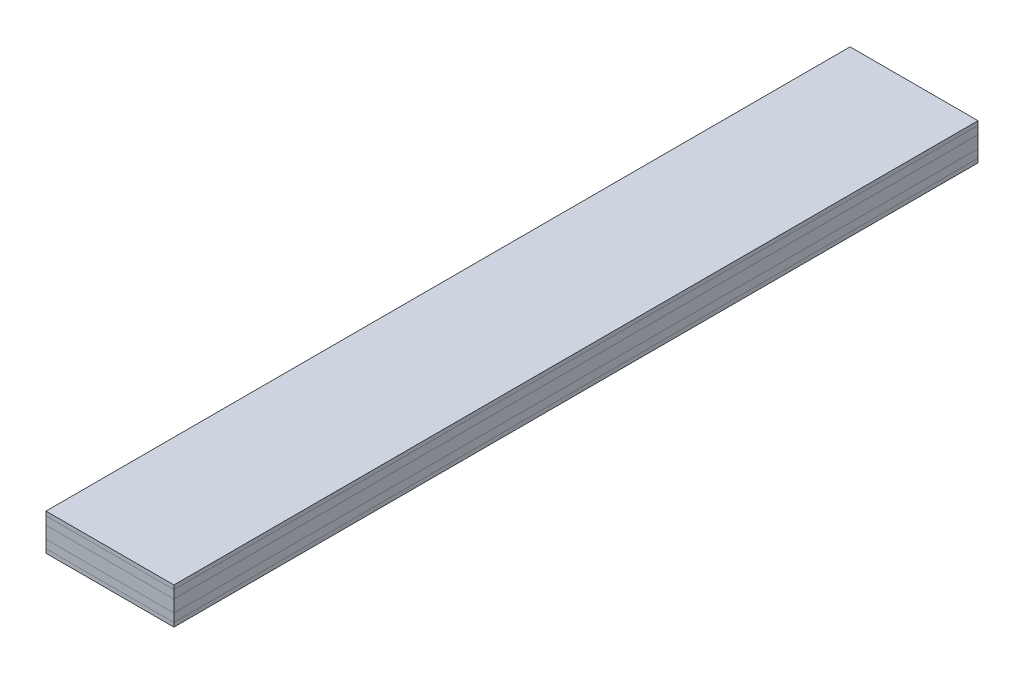
ISO-10303-21;
HEADER;
FILE_DESCRIPTION(('STEP AP214'),'2;1');
FILE_NAME('part.step','',(''),(''),'','','');
FILE_SCHEMA(('AUTOMOTIVE_DESIGN { 1 0 10303 214 1 1 1 1 }'));
ENDSEC;
DATA;
#1=APPLICATION_CONTEXT('core data for automotive mechanical design processes');
#2=APPLICATION_PROTOCOL_DEFINITION('international standard','automotive_design',2000,#1);
#3=PRODUCT_CONTEXT('',#1,'mechanical');
#4=PRODUCT('Part','Part','',(#3));
#5=PRODUCT_RELATED_PRODUCT_CATEGORY('part','',(#4));
#6=PRODUCT_DEFINITION_FORMATION('','',#4);
#7=PRODUCT_DEFINITION_CONTEXT('part definition',#1,'design');
#8=PRODUCT_DEFINITION('design','',#6,#7);
#9=PRODUCT_DEFINITION_SHAPE('','',#8);
#10=(LENGTH_UNIT() NAMED_UNIT(*) SI_UNIT(.MILLI.,.METRE.));
#11=(NAMED_UNIT(*) PLANE_ANGLE_UNIT() SI_UNIT($,.RADIAN.));
#12=(NAMED_UNIT(*) SI_UNIT($,.STERADIAN.) SOLID_ANGLE_UNIT());
#13=UNCERTAINTY_MEASURE_WITH_UNIT(LENGTH_MEASURE(1.E-05),#10,'distance_accuracy_value','');
#14=(GEOMETRIC_REPRESENTATION_CONTEXT(3) GLOBAL_UNCERTAINTY_ASSIGNED_CONTEXT((#13)) GLOBAL_UNIT_ASSIGNED_CONTEXT((#10,
#11,#12)) REPRESENTATION_CONTEXT('',''));
#15=CARTESIAN_POINT('',(0.,0.,0.));
#16=DIRECTION('',(0.,0.,1.));
#17=DIRECTION('',(1.,0.,0.));
#18=AXIS2_PLACEMENT_3D('',#15,#16,#17);
#19=CARTESIAN_POINT('',(-335.28,-2.82222222222222,-609.61));
#20=DIRECTION('',(0.,-1.,0.));
#21=DIRECTION('',(1.,0.,0.));
#22=AXIS2_PLACEMENT_3D('',#19,#20,#21);
#23=PLANE('',#22);
#24=DIRECTION('',(0.,0.,1.));
#25=VECTOR('',#24,1.);
#26=CARTESIAN_POINT('',(215.9,-2.82222222222212,-609.61));
#27=LINE('',#26,#25);
#28=CARTESIAN_POINT('',(215.9,-2.82222222222212,50.8000000000001));
#29=VERTEX_POINT('',#28);
#30=CARTESIAN_POINT('',(215.9,-2.82222222222212,609.6));
#31=VERTEX_POINT('',#30);
#32=EDGE_CURVE('E62',#29,#31,#27,.T.);
#33=ORIENTED_EDGE('',*,*,#32,.F.);
#34=DIRECTION('',(-1.,0.,0.));
#35=VECTOR('',#34,1.);
#36=CARTESIAN_POINT('',(-335.28,-2.82222222222222,50.8000000000001));
#37=LINE('',#36,#35);
#38=CARTESIAN_POINT('',(304.8,-2.82222222222217,50.8000000000001));
#39=VERTEX_POINT('',#38);
#40=EDGE_CURVE('E95',#39,#29,#37,.T.);
#41=ORIENTED_EDGE('',*,*,#40,.F.);
#42=DIRECTION('',(0.,0.,-1.));
#43=VECTOR('',#42,1.);
#44=CARTESIAN_POINT('',(304.8,-2.8222222222221,-609.6));
#45=LINE('',#44,#43);
#46=CARTESIAN_POINT('',(304.8,-2.82222222222217,609.6));
#47=VERTEX_POINT('',#46);
#48=EDGE_CURVE('E107',#47,#39,#45,.T.);
#49=ORIENTED_EDGE('',*,*,#48,.F.);
#50=DIRECTION('',(1.,0.,0.));
#51=VECTOR('',#50,1.);
#52=CARTESIAN_POINT('',(-304.8,-2.82222222222222,609.6));
#53=LINE('',#52,#51);
#54=EDGE_CURVE('E111',#31,#47,#53,.T.);
#55=ORIENTED_EDGE('',*,*,#54,.F.);
#56=EDGE_LOOP('',(#33,#41,#49,#55));
#57=FACE_BOUND('',#56,.T.);
#58=ADVANCED_FACE('F47',(#57),#23,.T.);
#59=CARTESIAN_POINT('',(0.,0.,0.));
#60=DIRECTION('',(0.,1.,0.));
#61=DIRECTION('',(0.,0.,1.));
#62=AXIS2_PLACEMENT_3D('',#59,#60,#61);
#63=PLANE('',#62);
#64=DIRECTION('',(0.,0.,-1.));
#65=VECTOR('',#64,1.);
#66=CARTESIAN_POINT('',(215.9,0.,0.));
#67=LINE('',#66,#65);
#68=CARTESIAN_POINT('',(215.9,0.,609.6));
#69=VERTEX_POINT('',#68);
#70=CARTESIAN_POINT('',(215.9,0.,50.8000000000001));
#71=VERTEX_POINT('',#70);
#72=EDGE_CURVE('E97',#69,#71,#67,.T.);
#73=ORIENTED_EDGE('',*,*,#72,.F.);
#74=DIRECTION('',(1.,0.,0.));
#75=VECTOR('',#74,1.);
#76=CARTESIAN_POINT('',(-304.8,0.,609.6));
#77=LINE('',#76,#75);
#78=CARTESIAN_POINT('',(304.8,0.,609.6));
#79=VERTEX_POINT('',#78);
#80=EDGE_CURVE('E70',#69,#79,#77,.T.);
#81=ORIENTED_EDGE('',*,*,#80,.T.);
#82=DIRECTION('',(0.,0.,-1.));
#83=VECTOR('',#82,1.);
#84=CARTESIAN_POINT('',(304.8,0.,-609.6));
#85=LINE('',#84,#83);
#86=CARTESIAN_POINT('',(304.8,0.,50.8000000000001));
#87=VERTEX_POINT('',#86);
#88=EDGE_CURVE('E102',#79,#87,#85,.T.);
#89=ORIENTED_EDGE('',*,*,#88,.T.);
#90=DIRECTION('',(1.,0.,0.));
#91=VECTOR('',#90,1.);
#92=CARTESIAN_POINT('',(0.,0.,50.8000000000001));
#93=LINE('',#92,#91);
#94=EDGE_CURVE('E92',#71,#87,#93,.T.);
#95=ORIENTED_EDGE('',*,*,#94,.F.);
#96=EDGE_LOOP('',(#73,#81,#89,#95));
#97=FACE_BOUND('',#96,.T.);
#98=ADVANCED_FACE('F100',(#97),#63,.T.);
#99=CARTESIAN_POINT('',(304.8,-25.4,-609.6));
#100=DIRECTION('',(1.,0.,0.));
#101=DIRECTION('',(0.,0.,-1.));
#102=AXIS2_PLACEMENT_3D('',#99,#100,#101);
#103=PLANE('',#102);
#104=DIRECTION('',(0.,-1.,0.));
#105=VECTOR('',#104,1.);
#106=CARTESIAN_POINT('',(304.8,-25.4,50.8));
#107=LINE('',#106,#105);
#108=EDGE_CURVE('E12',#87,#39,#107,.T.);
#109=ORIENTED_EDGE('',*,*,#108,.F.);
#110=ORIENTED_EDGE('',*,*,#88,.F.);
#111=DIRECTION('',(0.,1.,0.));
#112=VECTOR('',#111,1.);
#113=CARTESIAN_POINT('',(304.8,-25.4,609.6));
#114=LINE('',#113,#112);
#115=EDGE_CURVE('E109',#47,#79,#114,.T.);
#116=ORIENTED_EDGE('',*,*,#115,.F.);
#117=ORIENTED_EDGE('',*,*,#48,.T.);
#118=EDGE_LOOP('',(#109,#110,#116,#117));
#119=FACE_BOUND('',#118,.T.);
#120=ADVANCED_FACE('F120',(#119),#103,.T.);
#121=CARTESIAN_POINT('',(-304.8,-25.4,609.6));
#122=DIRECTION('',(0.,0.,1.));
#123=DIRECTION('',(1.,0.,0.));
#124=AXIS2_PLACEMENT_3D('',#121,#122,#123);
#125=PLANE('',#124);
#126=DIRECTION('',(0.,1.,0.));
#127=VECTOR('',#126,1.);
#128=CARTESIAN_POINT('',(215.9,-25.4,609.6));
#129=LINE('',#128,#127);
#130=EDGE_CURVE('E55',#31,#69,#129,.T.);
#131=ORIENTED_EDGE('',*,*,#130,.F.);
#132=ORIENTED_EDGE('',*,*,#54,.T.);
#133=ORIENTED_EDGE('',*,*,#115,.T.);
#134=ORIENTED_EDGE('',*,*,#80,.F.);
#135=EDGE_LOOP('',(#131,#132,#133,#134));
#136=FACE_BOUND('',#135,.T.);
#137=ADVANCED_FACE('F49',(#136),#125,.T.);
#138=CARTESIAN_POINT('',(215.9,-25.4,0.));
#139=DIRECTION('',(1.,0.,0.));
#140=DIRECTION('',(0.,0.,-1.));
#141=AXIS2_PLACEMENT_3D('',#138,#139,#140);
#142=PLANE('',#141);
#143=ORIENTED_EDGE('',*,*,#32,.T.);
#144=ORIENTED_EDGE('',*,*,#130,.T.);
#145=ORIENTED_EDGE('',*,*,#72,.T.);
#146=DIRECTION('',(0.,1.,0.));
#147=VECTOR('',#146,1.);
#148=CARTESIAN_POINT('',(215.9,-25.4,50.8000000000001));
#149=LINE('',#148,#147);
#150=EDGE_CURVE('E88',#29,#71,#149,.T.);
#151=ORIENTED_EDGE('',*,*,#150,.F.);
#152=EDGE_LOOP('',(#143,#144,#145,#151));
#153=FACE_BOUND('',#152,.T.);
#154=ADVANCED_FACE('F98',(#153),#142,.F.);
#155=CARTESIAN_POINT('',(0.,-25.4,50.8000000000001));
#156=DIRECTION('',(0.,0.,1.));
#157=DIRECTION('',(1.,0.,0.));
#158=AXIS2_PLACEMENT_3D('',#155,#156,#157);
#159=PLANE('',#158);
#160=ORIENTED_EDGE('',*,*,#40,.T.);
#161=ORIENTED_EDGE('',*,*,#150,.T.);
#162=ORIENTED_EDGE('',*,*,#94,.T.);
#163=ORIENTED_EDGE('',*,*,#108,.T.);
#164=EDGE_LOOP('',(#160,#161,#162,#163));
#165=FACE_BOUND('',#164,.T.);
#166=ADVANCED_FACE('F90',(#165),#159,.F.);
#167=CLOSED_SHELL('',(#58,#98,#120,#137,#154,#166));
#168=MANIFOLD_SOLID_BREP('B2',#167);
#169=CARTESIAN_POINT('',(-335.28,-22.5777777777778,-609.61));
#170=DIRECTION('',(0.,-1.,0.));
#171=DIRECTION('',(1.,0.,0.));
#172=AXIS2_PLACEMENT_3D('',#169,#170,#171);
#173=PLANE('',#172);
#174=DIRECTION('',(-1.,0.,0.));
#175=VECTOR('',#174,1.);
#176=CARTESIAN_POINT('',(-335.28,-22.5777777777778,50.8000000000001));
#177=LINE('',#176,#175);
#178=CARTESIAN_POINT('',(304.8,-22.5777777777777,50.8000000000001));
#179=VERTEX_POINT('',#178);
#180=CARTESIAN_POINT('',(215.9,-22.5777777777777,50.8000000000001));
#181=VERTEX_POINT('',#180);
#182=EDGE_CURVE('E242',#179,#181,#177,.T.);
#183=ORIENTED_EDGE('',*,*,#182,.T.);
#184=DIRECTION('',(0.,0.,1.));
#185=VECTOR('',#184,1.);
#186=CARTESIAN_POINT('',(215.9,-22.5777777777777,-609.61));
#187=LINE('',#186,#185);
#188=CARTESIAN_POINT('',(215.9,-22.5777777777777,609.6));
#189=VERTEX_POINT('',#188);
#190=EDGE_CURVE('E228',#181,#189,#187,.T.);
#191=ORIENTED_EDGE('',*,*,#190,.T.);
#192=DIRECTION('',(1.,0.,0.));
#193=VECTOR('',#192,1.);
#194=CARTESIAN_POINT('',(-304.8,-22.5777777777778,609.6));
#195=LINE('',#194,#193);
#196=CARTESIAN_POINT('',(304.8,-22.5777777777777,609.6));
#197=VERTEX_POINT('',#196);
#198=EDGE_CURVE('E246',#189,#197,#195,.T.);
#199=ORIENTED_EDGE('',*,*,#198,.T.);
#200=DIRECTION('',(0.,0.,-1.));
#201=VECTOR('',#200,1.);
#202=CARTESIAN_POINT('',(304.8,-22.5777777777777,-609.6));
#203=LINE('',#202,#201);
#204=EDGE_CURVE('E184',#197,#179,#203,.T.);
#205=ORIENTED_EDGE('',*,*,#204,.T.);
#206=EDGE_LOOP('',(#183,#191,#199,#205));
#207=FACE_BOUND('',#206,.T.);
#208=ADVANCED_FACE('F180',(#207),#173,.F.);
#209=CARTESIAN_POINT('',(304.8,-25.4,-609.6));
#210=DIRECTION('',(1.,0.,0.));
#211=DIRECTION('',(0.,0.,-1.));
#212=AXIS2_PLACEMENT_3D('',#209,#210,#211);
#213=PLANE('',#212);
#214=DIRECTION('',(0.,1.,0.));
#215=VECTOR('',#214,1.);
#216=CARTESIAN_POINT('',(304.8,-25.4,50.8000000000001));
#217=LINE('',#216,#215);
#218=CARTESIAN_POINT('',(304.8,-25.4,50.8000000000001));
#219=VERTEX_POINT('',#218);
#220=EDGE_CURVE('E197',#219,#179,#217,.T.);
#221=ORIENTED_EDGE('',*,*,#220,.T.);
#222=ORIENTED_EDGE('',*,*,#204,.F.);
#223=DIRECTION('',(0.,1.,0.));
#224=VECTOR('',#223,1.);
#225=CARTESIAN_POINT('',(304.8,-25.4,609.6));
#226=LINE('',#225,#224);
#227=CARTESIAN_POINT('',(304.8,-25.4,609.6));
#228=VERTEX_POINT('',#227);
#229=EDGE_CURVE('E247',#228,#197,#226,.T.);
#230=ORIENTED_EDGE('',*,*,#229,.F.);
#231=DIRECTION('',(0.,0.,-1.));
#232=VECTOR('',#231,1.);
#233=CARTESIAN_POINT('',(304.8,-25.4,-609.6));
#234=LINE('',#233,#232);
#235=EDGE_CURVE('E189',#228,#219,#234,.T.);
#236=ORIENTED_EDGE('',*,*,#235,.T.);
#237=EDGE_LOOP('',(#221,#222,#230,#236));
#238=FACE_BOUND('',#237,.T.);
#239=ADVANCED_FACE('F254',(#238),#213,.T.);
#240=CARTESIAN_POINT('',(-304.8,-25.4,609.6));
#241=DIRECTION('',(0.,0.,1.));
#242=DIRECTION('',(1.,0.,0.));
#243=AXIS2_PLACEMENT_3D('',#240,#241,#242);
#244=PLANE('',#243);
#245=DIRECTION('',(0.,1.,0.));
#246=VECTOR('',#245,1.);
#247=CARTESIAN_POINT('',(215.9,-25.4,609.6));
#248=LINE('',#247,#246);
#249=CARTESIAN_POINT('',(215.9,-25.4,609.6));
#250=VERTEX_POINT('',#249);
#251=EDGE_CURVE('E240',#250,#189,#248,.T.);
#252=ORIENTED_EDGE('',*,*,#251,.F.);
#253=DIRECTION('',(1.,0.,0.));
#254=VECTOR('',#253,1.);
#255=CARTESIAN_POINT('',(-304.8,-25.4,609.6));
#256=LINE('',#255,#254);
#257=EDGE_CURVE('E45',#250,#228,#256,.T.);
#258=ORIENTED_EDGE('',*,*,#257,.T.);
#259=ORIENTED_EDGE('',*,*,#229,.T.);
#260=ORIENTED_EDGE('',*,*,#198,.F.);
#261=EDGE_LOOP('',(#252,#258,#259,#260));
#262=FACE_BOUND('',#261,.T.);
#263=ADVANCED_FACE('F182',(#262),#244,.T.);
#264=CARTESIAN_POINT('',(0.,-25.4,0.));
#265=DIRECTION('',(0.,1.,0.));
#266=DIRECTION('',(0.,0.,1.));
#267=AXIS2_PLACEMENT_3D('',#264,#265,#266);
#268=PLANE('',#267);
#269=ORIENTED_EDGE('',*,*,#257,.F.);
#270=DIRECTION('',(0.,0.,-1.));
#271=VECTOR('',#270,1.);
#272=CARTESIAN_POINT('',(215.9,-25.4,0.));
#273=LINE('',#272,#271);
#274=CARTESIAN_POINT('',(215.9,-25.4,50.8000000000001));
#275=VERTEX_POINT('',#274);
#276=EDGE_CURVE('E226',#250,#275,#273,.T.);
#277=ORIENTED_EDGE('',*,*,#276,.T.);
#278=DIRECTION('',(1.,0.,0.));
#279=VECTOR('',#278,1.);
#280=CARTESIAN_POINT('',(0.,-25.4,50.8000000000001));
#281=LINE('',#280,#279);
#282=EDGE_CURVE('E230',#275,#219,#281,.T.);
#283=ORIENTED_EDGE('',*,*,#282,.T.);
#284=ORIENTED_EDGE('',*,*,#235,.F.);
#285=EDGE_LOOP('',(#269,#277,#283,#284));
#286=FACE_BOUND('',#285,.T.);
#287=ADVANCED_FACE('F237',(#286),#268,.F.);
#288=CARTESIAN_POINT('',(215.9,-25.4,0.));
#289=DIRECTION('',(1.,0.,0.));
#290=DIRECTION('',(0.,0.,-1.));
#291=AXIS2_PLACEMENT_3D('',#288,#289,#290);
#292=PLANE('',#291);
#293=DIRECTION('',(0.,1.,0.));
#294=VECTOR('',#293,1.);
#295=CARTESIAN_POINT('',(215.9,-25.4,50.8000000000001));
#296=LINE('',#295,#294);
#297=EDGE_CURVE('E223',#275,#181,#296,.T.);
#298=ORIENTED_EDGE('',*,*,#297,.F.);
#299=ORIENTED_EDGE('',*,*,#276,.F.);
#300=ORIENTED_EDGE('',*,*,#251,.T.);
#301=ORIENTED_EDGE('',*,*,#190,.F.);
#302=EDGE_LOOP('',(#298,#299,#300,#301));
#303=FACE_BOUND('',#302,.T.);
#304=ADVANCED_FACE('F224',(#303),#292,.F.);
#305=CARTESIAN_POINT('',(0.,-25.4,50.8000000000001));
#306=DIRECTION('',(0.,0.,1.));
#307=DIRECTION('',(1.,0.,0.));
#308=AXIS2_PLACEMENT_3D('',#305,#306,#307);
#309=PLANE('',#308);
#310=ORIENTED_EDGE('',*,*,#220,.F.);
#311=ORIENTED_EDGE('',*,*,#282,.F.);
#312=ORIENTED_EDGE('',*,*,#297,.T.);
#313=ORIENTED_EDGE('',*,*,#182,.F.);
#314=EDGE_LOOP('',(#310,#311,#312,#313));
#315=FACE_BOUND('',#314,.T.);
#316=ADVANCED_FACE('F232',(#315),#309,.F.);
#317=CLOSED_SHELL('',(#208,#239,#263,#287,#304,#316));
#318=MANIFOLD_SOLID_BREP('B6',#317);
#319=CARTESIAN_POINT('',(-335.28,-16.9333333333333,-609.61));
#320=DIRECTION('',(0.,-1.,0.));
#321=DIRECTION('',(1.,0.,0.));
#322=AXIS2_PLACEMENT_3D('',#319,#320,#321);
#323=PLANE('',#322);
#324=DIRECTION('',(-1.,0.,0.));
#325=VECTOR('',#324,1.);
#326=CARTESIAN_POINT('',(-335.28,-16.9333333333333,50.8000000000001));
#327=LINE('',#326,#325);
#328=CARTESIAN_POINT('',(304.8,-16.9333333333332,50.8000000000001));
#329=VERTEX_POINT('',#328);
#330=CARTESIAN_POINT('',(215.9,-16.9333333333332,50.8000000000001));
#331=VERTEX_POINT('',#330);
#332=EDGE_CURVE('E363',#329,#331,#327,.T.);
#333=ORIENTED_EDGE('',*,*,#332,.T.);
#334=DIRECTION('',(0.,0.,1.));
#335=VECTOR('',#334,1.);
#336=CARTESIAN_POINT('',(215.9,-16.9333333333332,-609.61));
#337=LINE('',#336,#335);
#338=CARTESIAN_POINT('',(215.9,-16.9333333333333,609.6));
#339=VERTEX_POINT('',#338);
#340=EDGE_CURVE('E354',#331,#339,#337,.T.);
#341=ORIENTED_EDGE('',*,*,#340,.T.);
#342=DIRECTION('',(1.,0.,0.));
#343=VECTOR('',#342,1.);
#344=CARTESIAN_POINT('',(-304.8,-16.9333333333333,609.6));
#345=LINE('',#344,#343);
#346=CARTESIAN_POINT('',(304.8,-16.9333333333333,609.6));
#347=VERTEX_POINT('',#346);
#348=EDGE_CURVE('E361',#339,#347,#345,.T.);
#349=ORIENTED_EDGE('',*,*,#348,.T.);
#350=DIRECTION('',(0.,0.,-1.));
#351=VECTOR('',#350,1.);
#352=CARTESIAN_POINT('',(304.8,-16.9333333333332,-609.6));
#353=LINE('',#352,#351);
#354=EDGE_CURVE('E367',#347,#329,#353,.T.);
#355=ORIENTED_EDGE('',*,*,#354,.T.);
#356=EDGE_LOOP('',(#333,#341,#349,#355));
#357=FACE_BOUND('',#356,.T.);
#358=ADVANCED_FACE('F313',(#357),#323,.F.);
#359=CARTESIAN_POINT('',(-335.28,-22.5777777777778,-609.61));
#360=DIRECTION('',(0.,-1.,0.));
#361=DIRECTION('',(1.,0.,0.));
#362=AXIS2_PLACEMENT_3D('',#359,#360,#361);
#363=PLANE('',#362);
#364=DIRECTION('',(0.,0.,1.));
#365=VECTOR('',#364,1.);
#366=CARTESIAN_POINT('',(215.9,-22.5777777777777,-609.61));
#367=LINE('',#366,#365);
#368=CARTESIAN_POINT('',(215.9,-22.5777777777777,50.8000000000001));
#369=VERTEX_POINT('',#368);
#370=CARTESIAN_POINT('',(215.9,-22.5777777777777,609.6));
#371=VERTEX_POINT('',#370);
#372=EDGE_CURVE('E328',#369,#371,#367,.T.);
#373=ORIENTED_EDGE('',*,*,#372,.F.);
#374=DIRECTION('',(-1.,0.,0.));
#375=VECTOR('',#374,1.);
#376=CARTESIAN_POINT('',(-335.28,-22.5777777777778,50.8000000000001));
#377=LINE('',#376,#375);
#378=CARTESIAN_POINT('',(304.8,-22.5777777777777,50.8000000000001));
#379=VERTEX_POINT('',#378);
#380=EDGE_CURVE('E364',#379,#369,#377,.T.);
#381=ORIENTED_EDGE('',*,*,#380,.F.);
#382=DIRECTION('',(0.,0.,-1.));
#383=VECTOR('',#382,1.);
#384=CARTESIAN_POINT('',(304.8,-22.5777777777777,-609.6));
#385=LINE('',#384,#383);
#386=CARTESIAN_POINT('',(304.8,-22.5777777777777,609.6));
#387=VERTEX_POINT('',#386);
#388=EDGE_CURVE('E369',#387,#379,#385,.T.);
#389=ORIENTED_EDGE('',*,*,#388,.F.);
#390=DIRECTION('',(1.,0.,0.));
#391=VECTOR('',#390,1.);
#392=CARTESIAN_POINT('',(-304.8,-22.5777777777778,609.6));
#393=LINE('',#392,#391);
#394=EDGE_CURVE('E335',#371,#387,#393,.T.);
#395=ORIENTED_EDGE('',*,*,#394,.F.);
#396=EDGE_LOOP('',(#373,#381,#389,#395));
#397=FACE_BOUND('',#396,.T.);
#398=ADVANCED_FACE('F386',(#397),#363,.T.);
#399=CARTESIAN_POINT('',(304.8,-25.4,-609.6));
#400=DIRECTION('',(1.,0.,0.));
#401=DIRECTION('',(0.,0.,-1.));
#402=AXIS2_PLACEMENT_3D('',#399,#400,#401);
#403=PLANE('',#402);
#404=DIRECTION('',(0.,-1.,0.));
#405=VECTOR('',#404,1.);
#406=CARTESIAN_POINT('',(304.8,-25.4,50.8));
#407=LINE('',#406,#405);
#408=EDGE_CURVE('E178',#329,#379,#407,.T.);
#409=ORIENTED_EDGE('',*,*,#408,.F.);
#410=ORIENTED_EDGE('',*,*,#354,.F.);
#411=DIRECTION('',(0.,1.,0.));
#412=VECTOR('',#411,1.);
#413=CARTESIAN_POINT('',(304.8,-25.4,609.6));
#414=LINE('',#413,#412);
#415=EDGE_CURVE('E357',#387,#347,#414,.T.);
#416=ORIENTED_EDGE('',*,*,#415,.F.);
#417=ORIENTED_EDGE('',*,*,#388,.T.);
#418=EDGE_LOOP('',(#409,#410,#416,#417));
#419=FACE_BOUND('',#418,.T.);
#420=ADVANCED_FACE('F387',(#419),#403,.T.);
#421=CARTESIAN_POINT('',(-304.8,-25.4,609.6));
#422=DIRECTION('',(0.,0.,1.));
#423=DIRECTION('',(1.,0.,0.));
#424=AXIS2_PLACEMENT_3D('',#421,#422,#423);
#425=PLANE('',#424);
#426=DIRECTION('',(0.,1.,0.));
#427=VECTOR('',#426,1.);
#428=CARTESIAN_POINT('',(215.9,-25.4,609.6));
#429=LINE('',#428,#427);
#430=EDGE_CURVE('E321',#371,#339,#429,.T.);
#431=ORIENTED_EDGE('',*,*,#430,.F.);
#432=ORIENTED_EDGE('',*,*,#394,.T.);
#433=ORIENTED_EDGE('',*,*,#415,.T.);
#434=ORIENTED_EDGE('',*,*,#348,.F.);
#435=EDGE_LOOP('',(#431,#432,#433,#434));
#436=FACE_BOUND('',#435,.T.);
#437=ADVANCED_FACE('F315',(#436),#425,.T.);
#438=CARTESIAN_POINT('',(0.,-25.4,50.8000000000001));
#439=DIRECTION('',(0.,0.,1.));
#440=DIRECTION('',(1.,0.,0.));
#441=AXIS2_PLACEMENT_3D('',#438,#439,#440);
#442=PLANE('',#441);
#443=ORIENTED_EDGE('',*,*,#408,.T.);
#444=ORIENTED_EDGE('',*,*,#380,.T.);
#445=DIRECTION('',(0.,1.,0.));
#446=VECTOR('',#445,1.);
#447=CARTESIAN_POINT('',(215.9,-25.4,50.8000000000001));
#448=LINE('',#447,#446);
#449=EDGE_CURVE('E381',#369,#331,#448,.T.);
#450=ORIENTED_EDGE('',*,*,#449,.T.);
#451=ORIENTED_EDGE('',*,*,#332,.F.);
#452=EDGE_LOOP('',(#443,#444,#450,#451));
#453=FACE_BOUND('',#452,.T.);
#454=ADVANCED_FACE('F383',(#453),#442,.F.);
#455=CARTESIAN_POINT('',(215.9,-25.4,0.));
#456=DIRECTION('',(1.,0.,0.));
#457=DIRECTION('',(0.,0.,-1.));
#458=AXIS2_PLACEMENT_3D('',#455,#456,#457);
#459=PLANE('',#458);
#460=ORIENTED_EDGE('',*,*,#449,.F.);
#461=ORIENTED_EDGE('',*,*,#372,.T.);
#462=ORIENTED_EDGE('',*,*,#430,.T.);
#463=ORIENTED_EDGE('',*,*,#340,.F.);
#464=EDGE_LOOP('',(#460,#461,#462,#463));
#465=FACE_BOUND('',#464,.T.);
#466=ADVANCED_FACE('F353',(#465),#459,.F.);
#467=CLOSED_SHELL('',(#358,#398,#420,#437,#454,#466));
#468=MANIFOLD_SOLID_BREP('B39',#467);
#469=CARTESIAN_POINT('',(-335.28,-8.46666666666667,-609.61));
#470=DIRECTION('',(0.,-1.,0.));
#471=DIRECTION('',(1.,0.,0.));
#472=AXIS2_PLACEMENT_3D('',#469,#470,#471);
#473=PLANE('',#472);
#474=DIRECTION('',(-1.,0.,0.));
#475=VECTOR('',#474,1.);
#476=CARTESIAN_POINT('',(-335.28,-8.46666666666667,50.8000000000001));
#477=LINE('',#476,#475);
#478=CARTESIAN_POINT('',(304.8,-8.46666666666656,50.8000000000001));
#479=VERTEX_POINT('',#478);
#480=CARTESIAN_POINT('',(215.9,-8.46666666666656,50.8000000000001));
#481=VERTEX_POINT('',#480);
#482=EDGE_CURVE('E495',#479,#481,#477,.T.);
#483=ORIENTED_EDGE('',*,*,#482,.T.);
#484=DIRECTION('',(0.,0.,1.));
#485=VECTOR('',#484,1.);
#486=CARTESIAN_POINT('',(215.9,-8.46666666666657,-609.61));
#487=LINE('',#486,#485);
#488=CARTESIAN_POINT('',(215.9,-8.46666666666662,609.6));
#489=VERTEX_POINT('',#488);
#490=EDGE_CURVE('E486',#481,#489,#487,.T.);
#491=ORIENTED_EDGE('',*,*,#490,.T.);
#492=DIRECTION('',(1.,0.,0.));
#493=VECTOR('',#492,1.);
#494=CARTESIAN_POINT('',(-304.8,-8.46666666666666,609.6));
#495=LINE('',#494,#493);
#496=CARTESIAN_POINT('',(304.8,-8.46666666666661,609.6));
#497=VERTEX_POINT('',#496);
#498=EDGE_CURVE('E493',#489,#497,#495,.T.);
#499=ORIENTED_EDGE('',*,*,#498,.T.);
#500=DIRECTION('',(0.,0.,-1.));
#501=VECTOR('',#500,1.);
#502=CARTESIAN_POINT('',(304.8,-8.46666666666655,-609.6));
#503=LINE('',#502,#501);
#504=EDGE_CURVE('E499',#497,#479,#503,.T.);
#505=ORIENTED_EDGE('',*,*,#504,.T.);
#506=EDGE_LOOP('',(#483,#491,#499,#505));
#507=FACE_BOUND('',#506,.T.);
#508=ADVANCED_FACE('F445',(#507),#473,.F.);
#509=CARTESIAN_POINT('',(-335.28,-16.9333333333333,-609.61));
#510=DIRECTION('',(0.,-1.,0.));
#511=DIRECTION('',(1.,0.,0.));
#512=AXIS2_PLACEMENT_3D('',#509,#510,#511);
#513=PLANE('',#512);
#514=DIRECTION('',(0.,0.,1.));
#515=VECTOR('',#514,1.);
#516=CARTESIAN_POINT('',(215.9,-16.9333333333332,-609.61));
#517=LINE('',#516,#515);
#518=CARTESIAN_POINT('',(215.9,-16.9333333333332,50.8000000000001));
#519=VERTEX_POINT('',#518);
#520=CARTESIAN_POINT('',(215.9,-16.9333333333332,609.6));
#521=VERTEX_POINT('',#520);
#522=EDGE_CURVE('E460',#519,#521,#517,.T.);
#523=ORIENTED_EDGE('',*,*,#522,.F.);
#524=DIRECTION('',(-1.,0.,0.));
#525=VECTOR('',#524,1.);
#526=CARTESIAN_POINT('',(-335.28,-16.9333333333333,50.8000000000001));
#527=LINE('',#526,#525);
#528=CARTESIAN_POINT('',(304.8,-16.9333333333333,50.8000000000001));
#529=VERTEX_POINT('',#528);
#530=EDGE_CURVE('E496',#529,#519,#527,.T.);
#531=ORIENTED_EDGE('',*,*,#530,.F.);
#532=DIRECTION('',(0.,0.,-1.));
#533=VECTOR('',#532,1.);
#534=CARTESIAN_POINT('',(304.8,-16.9333333333332,-609.6));
#535=LINE('',#534,#533);
#536=CARTESIAN_POINT('',(304.8,-16.9333333333333,609.6));
#537=VERTEX_POINT('',#536);
#538=EDGE_CURVE('E501',#537,#529,#535,.T.);
#539=ORIENTED_EDGE('',*,*,#538,.F.);
#540=DIRECTION('',(1.,0.,0.));
#541=VECTOR('',#540,1.);
#542=CARTESIAN_POINT('',(-304.8,-16.9333333333333,609.6));
#543=LINE('',#542,#541);
#544=EDGE_CURVE('E467',#521,#537,#543,.T.);
#545=ORIENTED_EDGE('',*,*,#544,.F.);
#546=EDGE_LOOP('',(#523,#531,#539,#545));
#547=FACE_BOUND('',#546,.T.);
#548=ADVANCED_FACE('F517',(#547),#513,.T.);
#549=CARTESIAN_POINT('',(304.8,-25.4,-609.6));
#550=DIRECTION('',(1.,0.,0.));
#551=DIRECTION('',(0.,0.,-1.));
#552=AXIS2_PLACEMENT_3D('',#549,#550,#551);
#553=PLANE('',#552);
#554=DIRECTION('',(0.,-1.,0.));
#555=VECTOR('',#554,1.);
#556=CARTESIAN_POINT('',(304.8,-25.4,50.8));
#557=LINE('',#556,#555);
#558=EDGE_CURVE('E311',#479,#529,#557,.T.);
#559=ORIENTED_EDGE('',*,*,#558,.F.);
#560=ORIENTED_EDGE('',*,*,#504,.F.);
#561=DIRECTION('',(0.,1.,0.));
#562=VECTOR('',#561,1.);
#563=CARTESIAN_POINT('',(304.8,-25.4,609.6));
#564=LINE('',#563,#562);
#565=EDGE_CURVE('E489',#537,#497,#564,.T.);
#566=ORIENTED_EDGE('',*,*,#565,.F.);
#567=ORIENTED_EDGE('',*,*,#538,.T.);
#568=EDGE_LOOP('',(#559,#560,#566,#567));
#569=FACE_BOUND('',#568,.T.);
#570=ADVANCED_FACE('F519',(#569),#553,.T.);
#571=CARTESIAN_POINT('',(-304.8,-25.4,609.6));
#572=DIRECTION('',(0.,0.,1.));
#573=DIRECTION('',(1.,0.,0.));
#574=AXIS2_PLACEMENT_3D('',#571,#572,#573);
#575=PLANE('',#574);
#576=DIRECTION('',(0.,1.,0.));
#577=VECTOR('',#576,1.);
#578=CARTESIAN_POINT('',(215.9,-25.4,609.6));
#579=LINE('',#578,#577);
#580=EDGE_CURVE('E453',#521,#489,#579,.T.);
#581=ORIENTED_EDGE('',*,*,#580,.F.);
#582=ORIENTED_EDGE('',*,*,#544,.T.);
#583=ORIENTED_EDGE('',*,*,#565,.T.);
#584=ORIENTED_EDGE('',*,*,#498,.F.);
#585=EDGE_LOOP('',(#581,#582,#583,#584));
#586=FACE_BOUND('',#585,.T.);
#587=ADVANCED_FACE('F447',(#586),#575,.T.);
#588=CARTESIAN_POINT('',(0.,-25.4,50.8000000000001));
#589=DIRECTION('',(0.,0.,1.));
#590=DIRECTION('',(1.,0.,0.));
#591=AXIS2_PLACEMENT_3D('',#588,#589,#590);
#592=PLANE('',#591);
#593=ORIENTED_EDGE('',*,*,#558,.T.);
#594=ORIENTED_EDGE('',*,*,#530,.T.);
#595=DIRECTION('',(0.,1.,0.));
#596=VECTOR('',#595,1.);
#597=CARTESIAN_POINT('',(215.9,-25.4,50.8000000000001));
#598=LINE('',#597,#596);
#599=EDGE_CURVE('E511',#519,#481,#598,.T.);
#600=ORIENTED_EDGE('',*,*,#599,.T.);
#601=ORIENTED_EDGE('',*,*,#482,.F.);
#602=EDGE_LOOP('',(#593,#594,#600,#601));
#603=FACE_BOUND('',#602,.T.);
#604=ADVANCED_FACE('F513',(#603),#592,.F.);
#605=CARTESIAN_POINT('',(215.9,-25.4,0.));
#606=DIRECTION('',(1.,0.,0.));
#607=DIRECTION('',(0.,0.,-1.));
#608=AXIS2_PLACEMENT_3D('',#605,#606,#607);
#609=PLANE('',#608);
#610=ORIENTED_EDGE('',*,*,#599,.F.);
#611=ORIENTED_EDGE('',*,*,#522,.T.);
#612=ORIENTED_EDGE('',*,*,#580,.T.);
#613=ORIENTED_EDGE('',*,*,#490,.F.);
#614=EDGE_LOOP('',(#610,#611,#612,#613));
#615=FACE_BOUND('',#614,.T.);
#616=ADVANCED_FACE('F485',(#615),#609,.F.);
#617=CLOSED_SHELL('',(#508,#548,#570,#587,#604,#616));
#618=MANIFOLD_SOLID_BREP('B172',#617);
#619=CARTESIAN_POINT('',(-335.28,-2.82222222222222,-609.61));
#620=DIRECTION('',(0.,-1.,0.));
#621=DIRECTION('',(1.,0.,0.));
#622=AXIS2_PLACEMENT_3D('',#619,#620,#621);
#623=PLANE('',#622);
#624=DIRECTION('',(-1.,0.,0.));
#625=VECTOR('',#624,1.);
#626=CARTESIAN_POINT('',(-335.28,-2.82222222222222,50.8000000000001));
#627=LINE('',#626,#625);
#628=CARTESIAN_POINT('',(304.8,-2.82222222222212,50.8000000000001));
#629=VERTEX_POINT('',#628);
#630=CARTESIAN_POINT('',(215.9,-2.82222222222212,50.8000000000001));
#631=VERTEX_POINT('',#630);
#632=EDGE_CURVE('E613',#629,#631,#627,.T.);
#633=ORIENTED_EDGE('',*,*,#632,.T.);
#634=DIRECTION('',(0.,0.,1.));
#635=VECTOR('',#634,1.);
#636=CARTESIAN_POINT('',(215.9,-2.82222222222212,-609.61));
#637=LINE('',#636,#635);
#638=CARTESIAN_POINT('',(215.9,-2.82222222222217,609.6));
#639=VERTEX_POINT('',#638);
#640=EDGE_CURVE('E608',#631,#639,#637,.T.);
#641=ORIENTED_EDGE('',*,*,#640,.T.);
#642=DIRECTION('',(1.,0.,0.));
#643=VECTOR('',#642,1.);
#644=CARTESIAN_POINT('',(-304.8,-2.82222222222222,609.6));
#645=LINE('',#644,#643);
#646=CARTESIAN_POINT('',(304.8,-2.82222222222217,609.6));
#647=VERTEX_POINT('',#646);
#648=EDGE_CURVE('E590',#639,#647,#645,.T.);
#649=ORIENTED_EDGE('',*,*,#648,.T.);
#650=DIRECTION('',(0.,0.,-1.));
#651=VECTOR('',#650,1.);
#652=CARTESIAN_POINT('',(304.8,-2.8222222222221,-609.6));
#653=LINE('',#652,#651);
#654=EDGE_CURVE('E620',#647,#629,#653,.T.);
#655=ORIENTED_EDGE('',*,*,#654,.T.);
#656=EDGE_LOOP('',(#633,#641,#649,#655));
#657=FACE_BOUND('',#656,.T.);
#658=ADVANCED_FACE('F568',(#657),#623,.F.);
#659=CARTESIAN_POINT('',(-335.28,-8.46666666666667,-609.61));
#660=DIRECTION('',(0.,-1.,0.));
#661=DIRECTION('',(1.,0.,0.));
#662=AXIS2_PLACEMENT_3D('',#659,#660,#661);
#663=PLANE('',#662);
#664=DIRECTION('',(0.,0.,1.));
#665=VECTOR('',#664,1.);
#666=CARTESIAN_POINT('',(215.9,-8.46666666666657,-609.61));
#667=LINE('',#666,#665);
#668=CARTESIAN_POINT('',(215.9,-8.46666666666656,50.8000000000001));
#669=VERTEX_POINT('',#668);
#670=CARTESIAN_POINT('',(215.9,-8.46666666666657,609.6));
#671=VERTEX_POINT('',#670);
#672=EDGE_CURVE('E582',#669,#671,#667,.T.);
#673=ORIENTED_EDGE('',*,*,#672,.F.);
#674=DIRECTION('',(-1.,0.,0.));
#675=VECTOR('',#674,1.);
#676=CARTESIAN_POINT('',(-335.28,-8.46666666666667,50.8000000000001));
#677=LINE('',#676,#675);
#678=CARTESIAN_POINT('',(304.8,-8.46666666666662,50.8000000000001));
#679=VERTEX_POINT('',#678);
#680=EDGE_CURVE('E614',#679,#669,#677,.T.);
#681=ORIENTED_EDGE('',*,*,#680,.F.);
#682=DIRECTION('',(0.,0.,-1.));
#683=VECTOR('',#682,1.);
#684=CARTESIAN_POINT('',(304.8,-8.46666666666655,-609.6));
#685=LINE('',#684,#683);
#686=CARTESIAN_POINT('',(304.8,-8.46666666666661,609.6));
#687=VERTEX_POINT('',#686);
#688=EDGE_CURVE('E622',#687,#679,#685,.T.);
#689=ORIENTED_EDGE('',*,*,#688,.F.);
#690=DIRECTION('',(1.,0.,0.));
#691=VECTOR('',#690,1.);
#692=CARTESIAN_POINT('',(-304.8,-8.46666666666666,609.6));
#693=LINE('',#692,#691);
#694=EDGE_CURVE('E627',#671,#687,#693,.T.);
#695=ORIENTED_EDGE('',*,*,#694,.F.);
#696=EDGE_LOOP('',(#673,#681,#689,#695));
#697=FACE_BOUND('',#696,.T.);
#698=ADVANCED_FACE('F636',(#697),#663,.T.);
#699=CARTESIAN_POINT('',(304.8,-25.4,-609.6));
#700=DIRECTION('',(1.,0.,0.));
#701=DIRECTION('',(0.,0.,-1.));
#702=AXIS2_PLACEMENT_3D('',#699,#700,#701);
#703=PLANE('',#702);
#704=DIRECTION('',(0.,-1.,0.));
#705=VECTOR('',#704,1.);
#706=CARTESIAN_POINT('',(304.8,-25.4,50.8));
#707=LINE('',#706,#705);
#708=EDGE_CURVE('E443',#629,#679,#707,.T.);
#709=ORIENTED_EDGE('',*,*,#708,.F.);
#710=ORIENTED_EDGE('',*,*,#654,.F.);
#711=DIRECTION('',(0.,1.,0.));
#712=VECTOR('',#711,1.);
#713=CARTESIAN_POINT('',(304.8,-25.4,609.6));
#714=LINE('',#713,#712);
#715=EDGE_CURVE('E619',#687,#647,#714,.T.);
#716=ORIENTED_EDGE('',*,*,#715,.F.);
#717=ORIENTED_EDGE('',*,*,#688,.T.);
#718=EDGE_LOOP('',(#709,#710,#716,#717));
#719=FACE_BOUND('',#718,.T.);
#720=ADVANCED_FACE('F633',(#719),#703,.T.);
#721=CARTESIAN_POINT('',(-304.8,-25.4,609.6));
#722=DIRECTION('',(0.,0.,1.));
#723=DIRECTION('',(1.,0.,0.));
#724=AXIS2_PLACEMENT_3D('',#721,#722,#723);
#725=PLANE('',#724);
#726=DIRECTION('',(0.,1.,0.));
#727=VECTOR('',#726,1.);
#728=CARTESIAN_POINT('',(215.9,-25.4,609.6));
#729=LINE('',#728,#727);
#730=EDGE_CURVE('E575',#671,#639,#729,.T.);
#731=ORIENTED_EDGE('',*,*,#730,.F.);
#732=ORIENTED_EDGE('',*,*,#694,.T.);
#733=ORIENTED_EDGE('',*,*,#715,.T.);
#734=ORIENTED_EDGE('',*,*,#648,.F.);
#735=EDGE_LOOP('',(#731,#732,#733,#734));
#736=FACE_BOUND('',#735,.T.);
#737=ADVANCED_FACE('F617',(#736),#725,.T.);
#738=CARTESIAN_POINT('',(0.,-25.4,50.8000000000001));
#739=DIRECTION('',(0.,0.,1.));
#740=DIRECTION('',(1.,0.,0.));
#741=AXIS2_PLACEMENT_3D('',#738,#739,#740);
#742=PLANE('',#741);
#743=ORIENTED_EDGE('',*,*,#708,.T.);
#744=ORIENTED_EDGE('',*,*,#680,.T.);
#745=DIRECTION('',(0.,1.,0.));
#746=VECTOR('',#745,1.);
#747=CARTESIAN_POINT('',(215.9,-25.4,50.8000000000001));
#748=LINE('',#747,#746);
#749=EDGE_CURVE('E641',#669,#631,#748,.T.);
#750=ORIENTED_EDGE('',*,*,#749,.T.);
#751=ORIENTED_EDGE('',*,*,#632,.F.);
#752=EDGE_LOOP('',(#743,#744,#750,#751));
#753=FACE_BOUND('',#752,.T.);
#754=ADVANCED_FACE('F642',(#753),#742,.F.);
#755=CARTESIAN_POINT('',(215.9,-25.4,0.));
#756=DIRECTION('',(1.,0.,0.));
#757=DIRECTION('',(0.,0.,-1.));
#758=AXIS2_PLACEMENT_3D('',#755,#756,#757);
#759=PLANE('',#758);
#760=ORIENTED_EDGE('',*,*,#749,.F.);
#761=ORIENTED_EDGE('',*,*,#672,.T.);
#762=ORIENTED_EDGE('',*,*,#730,.T.);
#763=ORIENTED_EDGE('',*,*,#640,.F.);
#764=EDGE_LOOP('',(#760,#761,#762,#763));
#765=FACE_BOUND('',#764,.T.);
#766=ADVANCED_FACE('F607',(#765),#759,.F.);
#767=CLOSED_SHELL('',(#658,#698,#720,#737,#754,#766));
#768=MANIFOLD_SOLID_BREP('B305',#767);
#769=ADVANCED_BREP_SHAPE_REPRESENTATION('',(#18,#168,#318,#468,#618,#768),#14);
#770=SHAPE_DEFINITION_REPRESENTATION(#9,#769);
ENDSEC;
END-ISO-10303-21;
